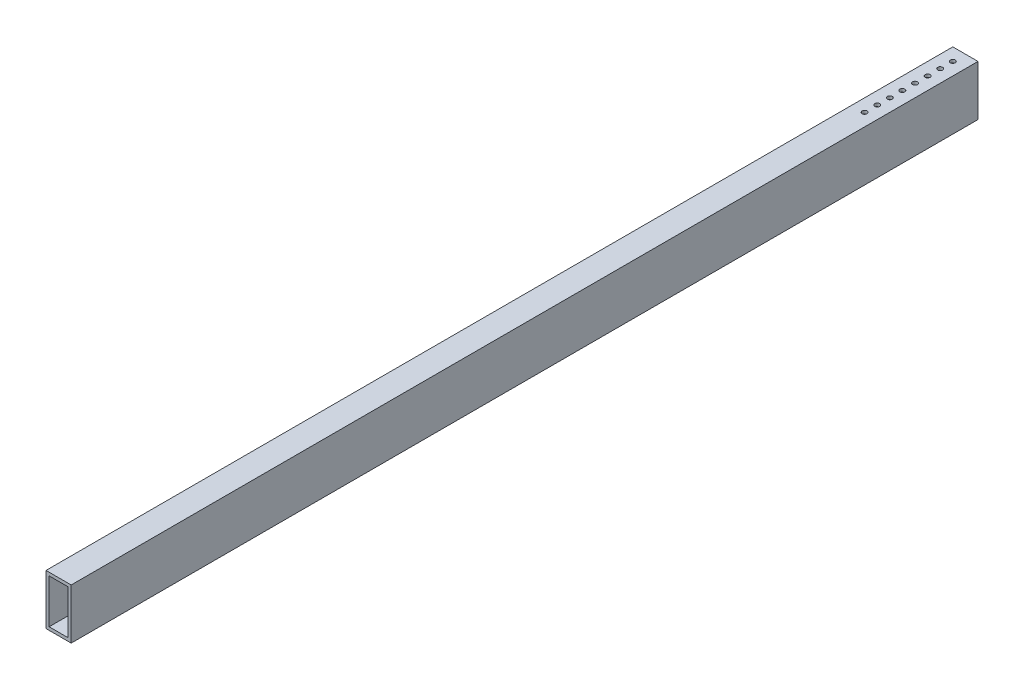
ISO-10303-21;
HEADER;
FILE_DESCRIPTION(('STEP AP214'),'2;1');
FILE_NAME('part.step','',(''),(''),'','','');
FILE_SCHEMA(('AUTOMOTIVE_DESIGN { 1 0 10303 214 1 1 1 1 }'));
ENDSEC;
DATA;
#1=APPLICATION_CONTEXT('core data for automotive mechanical design processes');
#2=APPLICATION_PROTOCOL_DEFINITION('international standard','automotive_design',2000,#1);
#3=PRODUCT_CONTEXT('',#1,'mechanical');
#4=PRODUCT('Part','Part','',(#3));
#5=PRODUCT_RELATED_PRODUCT_CATEGORY('part','',(#4));
#6=PRODUCT_DEFINITION_FORMATION('','',#4);
#7=PRODUCT_DEFINITION_CONTEXT('part definition',#1,'design');
#8=PRODUCT_DEFINITION('design','',#6,#7);
#9=PRODUCT_DEFINITION_SHAPE('','',#8);
#10=(LENGTH_UNIT() NAMED_UNIT(*) SI_UNIT(.MILLI.,.METRE.));
#11=(NAMED_UNIT(*) PLANE_ANGLE_UNIT() SI_UNIT($,.RADIAN.));
#12=(NAMED_UNIT(*) SI_UNIT($,.STERADIAN.) SOLID_ANGLE_UNIT());
#13=UNCERTAINTY_MEASURE_WITH_UNIT(LENGTH_MEASURE(1.E-05),#10,'distance_accuracy_value','');
#14=(GEOMETRIC_REPRESENTATION_CONTEXT(3) GLOBAL_UNCERTAINTY_ASSIGNED_CONTEXT((#13)) GLOBAL_UNIT_ASSIGNED_CONTEXT((#10,
#11,#12)) REPRESENTATION_CONTEXT('',''));
#15=CARTESIAN_POINT('',(0.,0.,0.));
#16=DIRECTION('',(0.,0.,1.));
#17=DIRECTION('',(1.,0.,0.));
#18=AXIS2_PLACEMENT_3D('',#15,#16,#17);
#19=CARTESIAN_POINT('',(0.,0.,914.4));
#20=DIRECTION('',(0.,0.,-1.));
#21=DIRECTION('',(-1.,0.,0.));
#22=AXIS2_PLACEMENT_3D('',#19,#20,#21);
#23=PLANE('',#22);
#24=DIRECTION('',(0.,1.,0.));
#25=VECTOR('',#24,1.);
#26=CARTESIAN_POINT('',(12.7,-25.4,914.4));
#27=LINE('',#26,#25);
#28=CARTESIAN_POINT('',(12.7,-25.4,914.4));
#29=VERTEX_POINT('',#28);
#30=CARTESIAN_POINT('',(12.7,25.4,914.4));
#31=VERTEX_POINT('',#30);
#32=EDGE_CURVE('E157',#29,#31,#27,.T.);
#33=ORIENTED_EDGE('',*,*,#32,.T.);
#34=DIRECTION('',(-1.,0.,0.));
#35=VECTOR('',#34,1.);
#36=CARTESIAN_POINT('',(-12.7,25.4,914.4));
#37=LINE('',#36,#35);
#38=CARTESIAN_POINT('',(-12.7,25.4,914.4));
#39=VERTEX_POINT('',#38);
#40=EDGE_CURVE('E161',#31,#39,#37,.T.);
#41=ORIENTED_EDGE('',*,*,#40,.T.);
#42=DIRECTION('',(0.,-1.,0.));
#43=VECTOR('',#42,1.);
#44=CARTESIAN_POINT('',(-12.7,-25.4,914.4));
#45=LINE('',#44,#43);
#46=CARTESIAN_POINT('',(-12.7,-25.4,914.4));
#47=VERTEX_POINT('',#46);
#48=EDGE_CURVE('E165',#39,#47,#45,.T.);
#49=ORIENTED_EDGE('',*,*,#48,.T.);
#50=DIRECTION('',(1.,0.,0.));
#51=VECTOR('',#50,1.);
#52=CARTESIAN_POINT('',(-12.7,-25.4,914.4));
#53=LINE('',#52,#51);
#54=EDGE_CURVE('E168',#47,#29,#53,.T.);
#55=ORIENTED_EDGE('',*,*,#54,.T.);
#56=EDGE_LOOP('',(#33,#41,#49,#55));
#57=FACE_BOUND('',#56,.T.);
#58=DIRECTION('',(1.,0.,0.));
#59=VECTOR('',#58,1.);
#60=CARTESIAN_POINT('',(-9.525,-22.225,914.4));
#61=LINE('',#60,#59);
#62=CARTESIAN_POINT('',(-9.525,-22.225,914.4));
#63=VERTEX_POINT('',#62);
#64=CARTESIAN_POINT('',(9.52499999999999,-22.225,914.4));
#65=VERTEX_POINT('',#64);
#66=EDGE_CURVE('E107',#63,#65,#61,.T.);
#67=ORIENTED_EDGE('',*,*,#66,.F.);
#68=DIRECTION('',(0.,-1.,0.));
#69=VECTOR('',#68,1.);
#70=CARTESIAN_POINT('',(-9.525,-22.225,914.4));
#71=LINE('',#70,#69);
#72=CARTESIAN_POINT('',(-9.525,22.225,914.4));
#73=VERTEX_POINT('',#72);
#74=EDGE_CURVE('E133',#73,#63,#71,.T.);
#75=ORIENTED_EDGE('',*,*,#74,.F.);
#76=DIRECTION('',(-1.,0.,0.));
#77=VECTOR('',#76,1.);
#78=CARTESIAN_POINT('',(-9.525,22.225,914.4));
#79=LINE('',#78,#77);
#80=CARTESIAN_POINT('',(9.525,22.225,914.4));
#81=VERTEX_POINT('',#80);
#82=EDGE_CURVE('E129',#81,#73,#79,.T.);
#83=ORIENTED_EDGE('',*,*,#82,.F.);
#84=DIRECTION('',(0.,1.,0.));
#85=VECTOR('',#84,1.);
#86=CARTESIAN_POINT('',(9.52499999999999,-22.225,914.4));
#87=LINE('',#86,#85);
#88=EDGE_CURVE('E116',#65,#81,#87,.T.);
#89=ORIENTED_EDGE('',*,*,#88,.F.);
#90=EDGE_LOOP('',(#67,#75,#83,#89));
#91=FACE_BOUND('',#90,.T.);
#92=ADVANCED_FACE('F39',(#57,#91),#23,.F.);
#93=CARTESIAN_POINT('',(0.,0.,0.));
#94=DIRECTION('',(0.,0.,-1.));
#95=DIRECTION('',(-1.,0.,0.));
#96=AXIS2_PLACEMENT_3D('',#93,#94,#95);
#97=PLANE('',#96);
#98=DIRECTION('',(0.,1.,0.));
#99=VECTOR('',#98,1.);
#100=CARTESIAN_POINT('',(12.7,-25.4,0.));
#101=LINE('',#100,#99);
#102=CARTESIAN_POINT('',(12.7,-25.4,0.));
#103=VERTEX_POINT('',#102);
#104=CARTESIAN_POINT('',(12.7,25.4,0.));
#105=VERTEX_POINT('',#104);
#106=EDGE_CURVE('E125',#103,#105,#101,.T.);
#107=ORIENTED_EDGE('',*,*,#106,.F.);
#108=DIRECTION('',(1.,0.,0.));
#109=VECTOR('',#108,1.);
#110=CARTESIAN_POINT('',(-12.7,-25.4,0.));
#111=LINE('',#110,#109);
#112=CARTESIAN_POINT('',(-12.7,-25.4,0.));
#113=VERTEX_POINT('',#112);
#114=EDGE_CURVE('E162',#113,#103,#111,.T.);
#115=ORIENTED_EDGE('',*,*,#114,.F.);
#116=DIRECTION('',(0.,-1.,0.));
#117=VECTOR('',#116,1.);
#118=CARTESIAN_POINT('',(-12.7,-25.4,0.));
#119=LINE('',#118,#117);
#120=CARTESIAN_POINT('',(-12.7,25.4,0.));
#121=VERTEX_POINT('',#120);
#122=EDGE_CURVE('E178',#121,#113,#119,.T.);
#123=ORIENTED_EDGE('',*,*,#122,.F.);
#124=DIRECTION('',(-1.,0.,0.));
#125=VECTOR('',#124,1.);
#126=CARTESIAN_POINT('',(-12.7,25.4,0.));
#127=LINE('',#126,#125);
#128=EDGE_CURVE('E175',#105,#121,#127,.T.);
#129=ORIENTED_EDGE('',*,*,#128,.F.);
#130=EDGE_LOOP('',(#107,#115,#123,#129));
#131=FACE_BOUND('',#130,.T.);
#132=DIRECTION('',(0.,-1.,0.));
#133=VECTOR('',#132,1.);
#134=CARTESIAN_POINT('',(-9.525,-22.225,0.));
#135=LINE('',#134,#133);
#136=CARTESIAN_POINT('',(-9.525,22.225,0.));
#137=VERTEX_POINT('',#136);
#138=CARTESIAN_POINT('',(-9.525,-22.225,0.));
#139=VERTEX_POINT('',#138);
#140=EDGE_CURVE('E117',#137,#139,#135,.T.);
#141=ORIENTED_EDGE('',*,*,#140,.T.);
#142=DIRECTION('',(1.,0.,0.));
#143=VECTOR('',#142,1.);
#144=CARTESIAN_POINT('',(-9.525,-22.225,0.));
#145=LINE('',#144,#143);
#146=CARTESIAN_POINT('',(9.52499999999999,-22.225,0.));
#147=VERTEX_POINT('',#146);
#148=EDGE_CURVE('E65',#139,#147,#145,.T.);
#149=ORIENTED_EDGE('',*,*,#148,.T.);
#150=DIRECTION('',(0.,1.,0.));
#151=VECTOR('',#150,1.);
#152=CARTESIAN_POINT('',(9.52499999999999,-22.225,0.));
#153=LINE('',#152,#151);
#154=CARTESIAN_POINT('',(9.525,22.225,0.));
#155=VERTEX_POINT('',#154);
#156=EDGE_CURVE('E123',#147,#155,#153,.T.);
#157=ORIENTED_EDGE('',*,*,#156,.T.);
#158=DIRECTION('',(-1.,0.,0.));
#159=VECTOR('',#158,1.);
#160=CARTESIAN_POINT('',(-9.525,22.225,0.));
#161=LINE('',#160,#159);
#162=EDGE_CURVE('E144',#155,#137,#161,.T.);
#163=ORIENTED_EDGE('',*,*,#162,.T.);
#164=EDGE_LOOP('',(#141,#149,#157,#163));
#165=FACE_BOUND('',#164,.T.);
#166=ADVANCED_FACE('F270',(#131,#165),#97,.T.);
#167=CARTESIAN_POINT('',(12.7,-25.4,914.4));
#168=DIRECTION('',(-1.,0.,0.));
#169=DIRECTION('',(0.,0.,1.));
#170=AXIS2_PLACEMENT_3D('',#167,#168,#169);
#171=PLANE('',#170);
#172=ORIENTED_EDGE('',*,*,#106,.T.);
#173=DIRECTION('',(0.,0.,-1.));
#174=VECTOR('',#173,1.);
#175=CARTESIAN_POINT('',(12.7,25.4,914.4));
#176=LINE('',#175,#174);
#177=EDGE_CURVE('E11',#31,#105,#176,.T.);
#178=ORIENTED_EDGE('',*,*,#177,.F.);
#179=ORIENTED_EDGE('',*,*,#32,.F.);
#180=DIRECTION('',(0.,0.,-1.));
#181=VECTOR('',#180,1.);
#182=CARTESIAN_POINT('',(12.7,-25.4,914.4));
#183=LINE('',#182,#181);
#184=EDGE_CURVE('E171',#29,#103,#183,.T.);
#185=ORIENTED_EDGE('',*,*,#184,.T.);
#186=EDGE_LOOP('',(#172,#178,#179,#185));
#187=FACE_BOUND('',#186,.T.);
#188=ADVANCED_FACE('F41',(#187),#171,.F.);
#189=CARTESIAN_POINT('',(-12.7,25.4,914.4));
#190=DIRECTION('',(0.,-1.,0.));
#191=DIRECTION('',(0.,0.,-1.));
#192=AXIS2_PLACEMENT_3D('',#189,#190,#191);
#193=PLANE('',#192);
#194=CARTESIAN_POINT('',(0.,25.4,12.7));
#195=DIRECTION('',(0.,1.,0.));
#196=DIRECTION('',(0.,0.,1.));
#197=AXIS2_PLACEMENT_3D('',#194,#195,#196);
#198=CIRCLE('',#197,2.4892);
#199=CARTESIAN_POINT('',(0.,25.4,15.1892));
#200=VERTEX_POINT('',#199);
#201=EDGE_CURVE('E309',#200,#200,#198,.T.);
#202=ORIENTED_EDGE('',*,*,#201,.F.);
#203=EDGE_LOOP('',(#202));
#204=FACE_BOUND('',#203,.T.);
#205=CARTESIAN_POINT('',(1.33803089727382E-13,25.4,25.4));
#206=DIRECTION('',(0.,1.,0.));
#207=DIRECTION('',(0.,0.,1.));
#208=AXIS2_PLACEMENT_3D('',#205,#206,#207);
#209=CIRCLE('',#208,2.4892);
#210=CARTESIAN_POINT('',(1.33803089727382E-13,25.4,27.8892));
#211=VERTEX_POINT('',#210);
#212=EDGE_CURVE('E313',#211,#211,#209,.T.);
#213=ORIENTED_EDGE('',*,*,#212,.F.);
#214=EDGE_LOOP('',(#213));
#215=FACE_BOUND('',#214,.T.);
#216=CARTESIAN_POINT('',(2.66050878019847E-13,25.4,38.1));
#217=DIRECTION('',(0.,1.,0.));
#218=DIRECTION('',(0.,0.,1.));
#219=AXIS2_PLACEMENT_3D('',#216,#217,#218);
#220=CIRCLE('',#219,2.4892);
#221=CARTESIAN_POINT('',(2.66050878019847E-13,25.4,40.5892));
#222=VERTEX_POINT('',#221);
#223=EDGE_CURVE('E317',#222,#222,#220,.T.);
#224=ORIENTED_EDGE('',*,*,#223,.F.);
#225=EDGE_LOOP('',(#224));
#226=FACE_BOUND('',#225,.T.);
#227=CARTESIAN_POINT('',(3.98298666312312E-13,25.4,50.8));
#228=DIRECTION('',(0.,1.,0.));
#229=DIRECTION('',(0.,0.,1.));
#230=AXIS2_PLACEMENT_3D('',#227,#228,#229);
#231=CIRCLE('',#230,2.4892);
#232=CARTESIAN_POINT('',(3.98298666312312E-13,25.4,53.2892));
#233=VERTEX_POINT('',#232);
#234=EDGE_CURVE('E321',#233,#233,#231,.T.);
#235=ORIENTED_EDGE('',*,*,#234,.F.);
#236=EDGE_LOOP('',(#235));
#237=FACE_BOUND('',#236,.T.);
#238=CARTESIAN_POINT('',(5.30546454604776E-13,25.4,63.5));
#239=DIRECTION('',(0.,1.,0.));
#240=DIRECTION('',(0.,0.,1.));
#241=AXIS2_PLACEMENT_3D('',#238,#239,#240);
#242=CIRCLE('',#241,2.4892);
#243=CARTESIAN_POINT('',(5.30546454604776E-13,25.4,65.9892));
#244=VERTEX_POINT('',#243);
#245=EDGE_CURVE('E325',#244,#244,#242,.T.);
#246=ORIENTED_EDGE('',*,*,#245,.F.);
#247=EDGE_LOOP('',(#246));
#248=FACE_BOUND('',#247,.T.);
#249=CARTESIAN_POINT('',(6.62794242897241E-13,25.4,76.2));
#250=DIRECTION('',(0.,1.,0.));
#251=DIRECTION('',(0.,0.,1.));
#252=AXIS2_PLACEMENT_3D('',#249,#250,#251);
#253=CIRCLE('',#252,2.4892);
#254=CARTESIAN_POINT('',(6.62794242897241E-13,25.4,78.6892));
#255=VERTEX_POINT('',#254);
#256=EDGE_CURVE('E329',#255,#255,#253,.T.);
#257=ORIENTED_EDGE('',*,*,#256,.F.);
#258=EDGE_LOOP('',(#257));
#259=FACE_BOUND('',#258,.T.);
#260=CARTESIAN_POINT('',(7.95042031189706E-13,25.4,88.9));
#261=DIRECTION('',(0.,1.,0.));
#262=DIRECTION('',(0.,0.,1.));
#263=AXIS2_PLACEMENT_3D('',#260,#261,#262);
#264=CIRCLE('',#263,2.4892);
#265=CARTESIAN_POINT('',(7.95042031189706E-13,25.4,91.3892));
#266=VERTEX_POINT('',#265);
#267=EDGE_CURVE('E333',#266,#266,#264,.T.);
#268=ORIENTED_EDGE('',*,*,#267,.F.);
#269=EDGE_LOOP('',(#268));
#270=FACE_BOUND('',#269,.T.);
#271=CARTESIAN_POINT('',(9.27289819482171E-13,25.4,101.6));
#272=DIRECTION('',(0.,1.,0.));
#273=DIRECTION('',(0.,0.,1.));
#274=AXIS2_PLACEMENT_3D('',#271,#272,#273);
#275=CIRCLE('',#274,2.4892);
#276=CARTESIAN_POINT('',(9.27289819482171E-13,25.4,104.0892));
#277=VERTEX_POINT('',#276);
#278=EDGE_CURVE('E337',#277,#277,#275,.T.);
#279=ORIENTED_EDGE('',*,*,#278,.F.);
#280=EDGE_LOOP('',(#279));
#281=FACE_BOUND('',#280,.T.);
#282=ORIENTED_EDGE('',*,*,#128,.T.);
#283=DIRECTION('',(0.,0.,-1.));
#284=VECTOR('',#283,1.);
#285=CARTESIAN_POINT('',(-12.7,25.4,914.4));
#286=LINE('',#285,#284);
#287=EDGE_CURVE('E49',#39,#121,#286,.T.);
#288=ORIENTED_EDGE('',*,*,#287,.F.);
#289=ORIENTED_EDGE('',*,*,#40,.F.);
#290=ORIENTED_EDGE('',*,*,#177,.T.);
#291=EDGE_LOOP('',(#282,#288,#289,#290));
#292=FACE_BOUND('',#291,.T.);
#293=ADVANCED_FACE('F298',(#204,#215,#226,#237,#248,#259,#270,#281,#292),#193,.F.);
#294=CARTESIAN_POINT('',(-12.7,-25.4,914.4));
#295=DIRECTION('',(1.,0.,0.));
#296=DIRECTION('',(0.,0.,-1.));
#297=AXIS2_PLACEMENT_3D('',#294,#295,#296);
#298=PLANE('',#297);
#299=ORIENTED_EDGE('',*,*,#122,.T.);
#300=DIRECTION('',(0.,0.,-1.));
#301=VECTOR('',#300,1.);
#302=CARTESIAN_POINT('',(-12.7,-25.4,914.4));
#303=LINE('',#302,#301);
#304=EDGE_CURVE('E186',#47,#113,#303,.T.);
#305=ORIENTED_EDGE('',*,*,#304,.F.);
#306=ORIENTED_EDGE('',*,*,#48,.F.);
#307=ORIENTED_EDGE('',*,*,#287,.T.);
#308=EDGE_LOOP('',(#299,#305,#306,#307));
#309=FACE_BOUND('',#308,.T.);
#310=ADVANCED_FACE('F295',(#309),#298,.F.);
#311=CARTESIAN_POINT('',(-12.7,-25.4,914.4));
#312=DIRECTION('',(0.,1.,0.));
#313=DIRECTION('',(0.,0.,1.));
#314=AXIS2_PLACEMENT_3D('',#311,#312,#313);
#315=PLANE('',#314);
#316=CARTESIAN_POINT('',(0.,-25.4,12.7));
#317=DIRECTION('',(0.,1.,0.));
#318=DIRECTION('',(0.,0.,1.));
#319=AXIS2_PLACEMENT_3D('',#316,#317,#318);
#320=CIRCLE('',#319,2.4892);
#321=CARTESIAN_POINT('',(0.,-25.4,15.1892));
#322=VERTEX_POINT('',#321);
#323=EDGE_CURVE('E198',#322,#322,#320,.T.);
#324=ORIENTED_EDGE('',*,*,#323,.T.);
#325=EDGE_LOOP('',(#324));
#326=FACE_BOUND('',#325,.T.);
#327=CARTESIAN_POINT('',(1.33803089727382E-13,-25.4,25.4));
#328=DIRECTION('',(0.,1.,0.));
#329=DIRECTION('',(0.,0.,1.));
#330=AXIS2_PLACEMENT_3D('',#327,#328,#329);
#331=CIRCLE('',#330,2.4892);
#332=CARTESIAN_POINT('',(1.33803089727382E-13,-25.4,27.8892));
#333=VERTEX_POINT('',#332);
#334=EDGE_CURVE('E433',#333,#333,#331,.T.);
#335=ORIENTED_EDGE('',*,*,#334,.T.);
#336=EDGE_LOOP('',(#335));
#337=FACE_BOUND('',#336,.T.);
#338=CARTESIAN_POINT('',(2.66050878019847E-13,-25.4,38.1));
#339=DIRECTION('',(0.,1.,0.));
#340=DIRECTION('',(0.,0.,1.));
#341=AXIS2_PLACEMENT_3D('',#338,#339,#340);
#342=CIRCLE('',#341,2.4892);
#343=CARTESIAN_POINT('',(2.66050878019847E-13,-25.4,40.5892));
#344=VERTEX_POINT('',#343);
#345=EDGE_CURVE('E440',#344,#344,#342,.T.);
#346=ORIENTED_EDGE('',*,*,#345,.T.);
#347=EDGE_LOOP('',(#346));
#348=FACE_BOUND('',#347,.T.);
#349=CARTESIAN_POINT('',(3.98298666312312E-13,-25.4,50.8));
#350=DIRECTION('',(0.,1.,0.));
#351=DIRECTION('',(0.,0.,1.));
#352=AXIS2_PLACEMENT_3D('',#349,#350,#351);
#353=CIRCLE('',#352,2.4892);
#354=CARTESIAN_POINT('',(3.98298666312312E-13,-25.4,53.2892));
#355=VERTEX_POINT('',#354);
#356=EDGE_CURVE('E449',#355,#355,#353,.T.);
#357=ORIENTED_EDGE('',*,*,#356,.T.);
#358=EDGE_LOOP('',(#357));
#359=FACE_BOUND('',#358,.T.);
#360=CARTESIAN_POINT('',(5.30546454604776E-13,-25.4,63.5));
#361=DIRECTION('',(0.,1.,0.));
#362=DIRECTION('',(0.,0.,1.));
#363=AXIS2_PLACEMENT_3D('',#360,#361,#362);
#364=CIRCLE('',#363,2.4892);
#365=CARTESIAN_POINT('',(5.30546454604776E-13,-25.4,65.9892));
#366=VERTEX_POINT('',#365);
#367=EDGE_CURVE('E455',#366,#366,#364,.T.);
#368=ORIENTED_EDGE('',*,*,#367,.T.);
#369=EDGE_LOOP('',(#368));
#370=FACE_BOUND('',#369,.T.);
#371=CARTESIAN_POINT('',(6.62794242897241E-13,-25.4,76.2));
#372=DIRECTION('',(0.,1.,0.));
#373=DIRECTION('',(0.,0.,1.));
#374=AXIS2_PLACEMENT_3D('',#371,#372,#373);
#375=CIRCLE('',#374,2.4892);
#376=CARTESIAN_POINT('',(6.62794242897241E-13,-25.4,78.6892));
#377=VERTEX_POINT('',#376);
#378=EDGE_CURVE('E461',#377,#377,#375,.T.);
#379=ORIENTED_EDGE('',*,*,#378,.T.);
#380=EDGE_LOOP('',(#379));
#381=FACE_BOUND('',#380,.T.);
#382=CARTESIAN_POINT('',(7.95042031189706E-13,-25.4,88.9));
#383=DIRECTION('',(0.,1.,0.));
#384=DIRECTION('',(0.,0.,1.));
#385=AXIS2_PLACEMENT_3D('',#382,#383,#384);
#386=CIRCLE('',#385,2.4892);
#387=CARTESIAN_POINT('',(7.95042031189706E-13,-25.4,91.3892));
#388=VERTEX_POINT('',#387);
#389=EDGE_CURVE('E467',#388,#388,#386,.T.);
#390=ORIENTED_EDGE('',*,*,#389,.T.);
#391=EDGE_LOOP('',(#390));
#392=FACE_BOUND('',#391,.T.);
#393=CARTESIAN_POINT('',(9.27289819482171E-13,-25.4,101.6));
#394=DIRECTION('',(0.,1.,0.));
#395=DIRECTION('',(0.,0.,1.));
#396=AXIS2_PLACEMENT_3D('',#393,#394,#395);
#397=CIRCLE('',#396,2.4892);
#398=CARTESIAN_POINT('',(9.27289819482171E-13,-25.4,104.0892));
#399=VERTEX_POINT('',#398);
#400=EDGE_CURVE('E351',#399,#399,#397,.T.);
#401=ORIENTED_EDGE('',*,*,#400,.T.);
#402=EDGE_LOOP('',(#401));
#403=FACE_BOUND('',#402,.T.);
#404=ORIENTED_EDGE('',*,*,#114,.T.);
#405=ORIENTED_EDGE('',*,*,#184,.F.);
#406=ORIENTED_EDGE('',*,*,#54,.F.);
#407=ORIENTED_EDGE('',*,*,#304,.T.);
#408=EDGE_LOOP('',(#404,#405,#406,#407));
#409=FACE_BOUND('',#408,.T.);
#410=ADVANCED_FACE('F292',(#326,#337,#348,#359,#370,#381,#392,#403,#409),#315,.F.);
#411=CARTESIAN_POINT('',(-9.525,-22.225,914.4));
#412=DIRECTION('',(0.,1.,0.));
#413=DIRECTION('',(0.,0.,1.));
#414=AXIS2_PLACEMENT_3D('',#411,#412,#413);
#415=PLANE('',#414);
#416=CARTESIAN_POINT('',(0.,-22.225,12.7));
#417=DIRECTION('',(0.,1.,0.));
#418=DIRECTION('',(0.,0.,1.));
#419=AXIS2_PLACEMENT_3D('',#416,#417,#418);
#420=CIRCLE('',#419,2.4892);
#421=CARTESIAN_POINT('',(0.,-22.225,15.1892));
#422=VERTEX_POINT('',#421);
#423=EDGE_CURVE('E141',#422,#422,#420,.T.);
#424=ORIENTED_EDGE('',*,*,#423,.F.);
#425=EDGE_LOOP('',(#424));
#426=FACE_BOUND('',#425,.T.);
#427=CARTESIAN_POINT('',(1.33803089727382E-13,-22.225,25.4));
#428=DIRECTION('',(0.,1.,0.));
#429=DIRECTION('',(0.,0.,1.));
#430=AXIS2_PLACEMENT_3D('',#427,#428,#429);
#431=CIRCLE('',#430,2.4892);
#432=CARTESIAN_POINT('',(1.33803089727382E-13,-22.225,27.8892));
#433=VERTEX_POINT('',#432);
#434=EDGE_CURVE('E226',#433,#433,#431,.T.);
#435=ORIENTED_EDGE('',*,*,#434,.F.);
#436=EDGE_LOOP('',(#435));
#437=FACE_BOUND('',#436,.T.);
#438=CARTESIAN_POINT('',(2.66050878019847E-13,-22.225,38.1));
#439=DIRECTION('',(0.,1.,0.));
#440=DIRECTION('',(0.,0.,1.));
#441=AXIS2_PLACEMENT_3D('',#438,#439,#440);
#442=CIRCLE('',#441,2.4892);
#443=CARTESIAN_POINT('',(2.66050878019847E-13,-22.225,40.5892));
#444=VERTEX_POINT('',#443);
#445=EDGE_CURVE('E222',#444,#444,#442,.T.);
#446=ORIENTED_EDGE('',*,*,#445,.F.);
#447=EDGE_LOOP('',(#446));
#448=FACE_BOUND('',#447,.T.);
#449=CARTESIAN_POINT('',(3.98298666312312E-13,-22.225,50.8));
#450=DIRECTION('',(0.,1.,0.));
#451=DIRECTION('',(0.,0.,1.));
#452=AXIS2_PLACEMENT_3D('',#449,#450,#451);
#453=CIRCLE('',#452,2.4892);
#454=CARTESIAN_POINT('',(3.98298666312312E-13,-22.225,53.2892));
#455=VERTEX_POINT('',#454);
#456=EDGE_CURVE('E218',#455,#455,#453,.T.);
#457=ORIENTED_EDGE('',*,*,#456,.F.);
#458=EDGE_LOOP('',(#457));
#459=FACE_BOUND('',#458,.T.);
#460=CARTESIAN_POINT('',(5.30546454604776E-13,-22.225,63.5));
#461=DIRECTION('',(0.,1.,0.));
#462=DIRECTION('',(0.,0.,1.));
#463=AXIS2_PLACEMENT_3D('',#460,#461,#462);
#464=CIRCLE('',#463,2.4892);
#465=CARTESIAN_POINT('',(5.30546454604776E-13,-22.225,65.9892));
#466=VERTEX_POINT('',#465);
#467=EDGE_CURVE('E213',#466,#466,#464,.T.);
#468=ORIENTED_EDGE('',*,*,#467,.F.);
#469=EDGE_LOOP('',(#468));
#470=FACE_BOUND('',#469,.T.);
#471=CARTESIAN_POINT('',(6.62794242897241E-13,-22.225,76.2));
#472=DIRECTION('',(0.,1.,0.));
#473=DIRECTION('',(0.,0.,1.));
#474=AXIS2_PLACEMENT_3D('',#471,#472,#473);
#475=CIRCLE('',#474,2.4892);
#476=CARTESIAN_POINT('',(6.62794242897241E-13,-22.225,78.6892));
#477=VERTEX_POINT('',#476);
#478=EDGE_CURVE('E208',#477,#477,#475,.T.);
#479=ORIENTED_EDGE('',*,*,#478,.F.);
#480=EDGE_LOOP('',(#479));
#481=FACE_BOUND('',#480,.T.);
#482=CARTESIAN_POINT('',(7.95042031189706E-13,-22.225,88.9));
#483=DIRECTION('',(0.,1.,0.));
#484=DIRECTION('',(0.,0.,1.));
#485=AXIS2_PLACEMENT_3D('',#482,#483,#484);
#486=CIRCLE('',#485,2.4892);
#487=CARTESIAN_POINT('',(7.95042031189706E-13,-22.225,91.3892));
#488=VERTEX_POINT('',#487);
#489=EDGE_CURVE('E203',#488,#488,#486,.T.);
#490=ORIENTED_EDGE('',*,*,#489,.F.);
#491=EDGE_LOOP('',(#490));
#492=FACE_BOUND('',#491,.T.);
#493=CARTESIAN_POINT('',(9.27289819482171E-13,-22.225,101.6));
#494=DIRECTION('',(0.,1.,0.));
#495=DIRECTION('',(0.,0.,1.));
#496=AXIS2_PLACEMENT_3D('',#493,#494,#495);
#497=CIRCLE('',#496,2.4892);
#498=CARTESIAN_POINT('',(9.27289819482171E-13,-22.225,104.0892));
#499=VERTEX_POINT('',#498);
#500=EDGE_CURVE('E197',#499,#499,#497,.T.);
#501=ORIENTED_EDGE('',*,*,#500,.F.);
#502=EDGE_LOOP('',(#501));
#503=FACE_BOUND('',#502,.T.);
#504=ORIENTED_EDGE('',*,*,#148,.F.);
#505=DIRECTION('',(0.,0.,-1.));
#506=VECTOR('',#505,1.);
#507=CARTESIAN_POINT('',(-9.525,-22.225,914.4));
#508=LINE('',#507,#506);
#509=EDGE_CURVE('E111',#63,#139,#508,.T.);
#510=ORIENTED_EDGE('',*,*,#509,.F.);
#511=ORIENTED_EDGE('',*,*,#66,.T.);
#512=DIRECTION('',(0.,0.,-1.));
#513=VECTOR('',#512,1.);
#514=CARTESIAN_POINT('',(9.52499999999999,-22.225,914.4));
#515=LINE('',#514,#513);
#516=EDGE_CURVE('E110',#65,#147,#515,.T.);
#517=ORIENTED_EDGE('',*,*,#516,.T.);
#518=EDGE_LOOP('',(#504,#510,#511,#517));
#519=FACE_BOUND('',#518,.T.);
#520=ADVANCED_FACE('F109',(#426,#437,#448,#459,#470,#481,#492,#503,#519),#415,.T.);
#521=CARTESIAN_POINT('',(9.52499999999999,-22.225,914.4));
#522=DIRECTION('',(-1.,0.,0.));
#523=DIRECTION('',(0.,-1.,0.));
#524=AXIS2_PLACEMENT_3D('',#521,#522,#523);
#525=PLANE('',#524);
#526=ORIENTED_EDGE('',*,*,#156,.F.);
#527=ORIENTED_EDGE('',*,*,#516,.F.);
#528=ORIENTED_EDGE('',*,*,#88,.T.);
#529=DIRECTION('',(0.,0.,-1.));
#530=VECTOR('',#529,1.);
#531=CARTESIAN_POINT('',(9.525,22.225,914.4));
#532=LINE('',#531,#530);
#533=EDGE_CURVE('E126',#81,#155,#532,.T.);
#534=ORIENTED_EDGE('',*,*,#533,.T.);
#535=EDGE_LOOP('',(#526,#527,#528,#534));
#536=FACE_BOUND('',#535,.T.);
#537=ADVANCED_FACE('F120',(#536),#525,.T.);
#538=CARTESIAN_POINT('',(-9.525,22.225,914.4));
#539=DIRECTION('',(0.,-1.,0.));
#540=DIRECTION('',(1.,0.,0.));
#541=AXIS2_PLACEMENT_3D('',#538,#539,#540);
#542=PLANE('',#541);
#543=CARTESIAN_POINT('',(0.,22.225,12.7));
#544=DIRECTION('',(0.,-1.,0.));
#545=DIRECTION('',(1.,0.,0.));
#546=AXIS2_PLACEMENT_3D('',#543,#544,#545);
#547=CIRCLE('',#546,2.4892);
#548=CARTESIAN_POINT('',(2.4892,22.225,12.7));
#549=VERTEX_POINT('',#548);
#550=EDGE_CURVE('E43',#549,#549,#547,.T.);
#551=ORIENTED_EDGE('',*,*,#550,.F.);
#552=EDGE_LOOP('',(#551));
#553=FACE_BOUND('',#552,.T.);
#554=CARTESIAN_POINT('',(1.33803089727382E-13,22.225,25.4));
#555=DIRECTION('',(0.,-1.,0.));
#556=DIRECTION('',(1.,0.,0.));
#557=AXIS2_PLACEMENT_3D('',#554,#555,#556);
#558=CIRCLE('',#557,2.4892);
#559=CARTESIAN_POINT('',(2.48920000000013,22.225,25.4));
#560=VERTEX_POINT('',#559);
#561=EDGE_CURVE('E223',#560,#560,#558,.T.);
#562=ORIENTED_EDGE('',*,*,#561,.F.);
#563=EDGE_LOOP('',(#562));
#564=FACE_BOUND('',#563,.T.);
#565=CARTESIAN_POINT('',(2.66050878019847E-13,22.225,38.1));
#566=DIRECTION('',(0.,-1.,0.));
#567=DIRECTION('',(1.,0.,0.));
#568=AXIS2_PLACEMENT_3D('',#565,#566,#567);
#569=CIRCLE('',#568,2.4892);
#570=CARTESIAN_POINT('',(2.48920000000027,22.225,38.1));
#571=VERTEX_POINT('',#570);
#572=EDGE_CURVE('E219',#571,#571,#569,.T.);
#573=ORIENTED_EDGE('',*,*,#572,.F.);
#574=EDGE_LOOP('',(#573));
#575=FACE_BOUND('',#574,.T.);
#576=CARTESIAN_POINT('',(3.98298666312312E-13,22.225,50.8));
#577=DIRECTION('',(0.,-1.,0.));
#578=DIRECTION('',(1.,0.,0.));
#579=AXIS2_PLACEMENT_3D('',#576,#577,#578);
#580=CIRCLE('',#579,2.4892);
#581=CARTESIAN_POINT('',(2.4892000000004,22.225,50.8));
#582=VERTEX_POINT('',#581);
#583=EDGE_CURVE('E214',#582,#582,#580,.T.);
#584=ORIENTED_EDGE('',*,*,#583,.F.);
#585=EDGE_LOOP('',(#584));
#586=FACE_BOUND('',#585,.T.);
#587=CARTESIAN_POINT('',(5.30546454604776E-13,22.225,63.5));
#588=DIRECTION('',(0.,-1.,0.));
#589=DIRECTION('',(1.,0.,0.));
#590=AXIS2_PLACEMENT_3D('',#587,#588,#589);
#591=CIRCLE('',#590,2.4892);
#592=CARTESIAN_POINT('',(2.48920000000053,22.225,63.5));
#593=VERTEX_POINT('',#592);
#594=EDGE_CURVE('E209',#593,#593,#591,.T.);
#595=ORIENTED_EDGE('',*,*,#594,.F.);
#596=EDGE_LOOP('',(#595));
#597=FACE_BOUND('',#596,.T.);
#598=CARTESIAN_POINT('',(6.62794242897241E-13,22.225,76.2));
#599=DIRECTION('',(0.,-1.,0.));
#600=DIRECTION('',(1.,0.,0.));
#601=AXIS2_PLACEMENT_3D('',#598,#599,#600);
#602=CIRCLE('',#601,2.4892);
#603=CARTESIAN_POINT('',(2.48920000000066,22.225,76.2));
#604=VERTEX_POINT('',#603);
#605=EDGE_CURVE('E204',#604,#604,#602,.T.);
#606=ORIENTED_EDGE('',*,*,#605,.F.);
#607=EDGE_LOOP('',(#606));
#608=FACE_BOUND('',#607,.T.);
#609=CARTESIAN_POINT('',(7.95042031189706E-13,22.225,88.9));
#610=DIRECTION('',(0.,-1.,0.));
#611=DIRECTION('',(1.,0.,0.));
#612=AXIS2_PLACEMENT_3D('',#609,#610,#611);
#613=CIRCLE('',#612,2.4892);
#614=CARTESIAN_POINT('',(2.48920000000079,22.225,88.9));
#615=VERTEX_POINT('',#614);
#616=EDGE_CURVE('E199',#615,#615,#613,.T.);
#617=ORIENTED_EDGE('',*,*,#616,.F.);
#618=EDGE_LOOP('',(#617));
#619=FACE_BOUND('',#618,.T.);
#620=CARTESIAN_POINT('',(9.27289819482171E-13,22.225,101.6));
#621=DIRECTION('',(0.,-1.,0.));
#622=DIRECTION('',(1.,0.,0.));
#623=AXIS2_PLACEMENT_3D('',#620,#621,#622);
#624=CIRCLE('',#623,2.4892);
#625=CARTESIAN_POINT('',(2.48920000000093,22.225,101.6));
#626=VERTEX_POINT('',#625);
#627=EDGE_CURVE('E193',#626,#626,#624,.T.);
#628=ORIENTED_EDGE('',*,*,#627,.F.);
#629=EDGE_LOOP('',(#628));
#630=FACE_BOUND('',#629,.T.);
#631=ORIENTED_EDGE('',*,*,#162,.F.);
#632=ORIENTED_EDGE('',*,*,#533,.F.);
#633=ORIENTED_EDGE('',*,*,#82,.T.);
#634=DIRECTION('',(0.,0.,-1.));
#635=VECTOR('',#634,1.);
#636=CARTESIAN_POINT('',(-9.525,22.225,914.4));
#637=LINE('',#636,#635);
#638=EDGE_CURVE('E57',#73,#137,#637,.T.);
#639=ORIENTED_EDGE('',*,*,#638,.T.);
#640=EDGE_LOOP('',(#631,#632,#633,#639));
#641=FACE_BOUND('',#640,.T.);
#642=ADVANCED_FACE('F250',(#553,#564,#575,#586,#597,#608,#619,#630,#641),#542,.T.);
#643=CARTESIAN_POINT('',(-9.525,-22.225,914.4));
#644=DIRECTION('',(1.,0.,0.));
#645=DIRECTION('',(0.,0.,-1.));
#646=AXIS2_PLACEMENT_3D('',#643,#644,#645);
#647=PLANE('',#646);
#648=ORIENTED_EDGE('',*,*,#140,.F.);
#649=ORIENTED_EDGE('',*,*,#638,.F.);
#650=ORIENTED_EDGE('',*,*,#74,.T.);
#651=ORIENTED_EDGE('',*,*,#509,.T.);
#652=EDGE_LOOP('',(#648,#649,#650,#651));
#653=FACE_BOUND('',#652,.T.);
#654=ADVANCED_FACE('F253',(#653),#647,.T.);
#655=CARTESIAN_POINT('',(9.27289819482171E-13,-25.4,101.6));
#656=DIRECTION('',(0.,1.,0.));
#657=DIRECTION('',(0.,0.,1.));
#658=AXIS2_PLACEMENT_3D('',#655,#656,#657);
#659=CYLINDRICAL_SURFACE('',#658,2.4892);
#660=ORIENTED_EDGE('',*,*,#627,.T.);
#661=EDGE_LOOP('',(#660));
#662=FACE_BOUND('',#661,.T.);
#663=ORIENTED_EDGE('',*,*,#278,.T.);
#664=EDGE_LOOP('',(#663));
#665=FACE_BOUND('',#664,.T.);
#666=ADVANCED_FACE('F272',(#662,#665),#659,.F.);
#667=CARTESIAN_POINT('',(7.95042031189706E-13,-25.4,88.9));
#668=DIRECTION('',(0.,1.,0.));
#669=DIRECTION('',(0.,0.,1.));
#670=AXIS2_PLACEMENT_3D('',#667,#668,#669);
#671=CYLINDRICAL_SURFACE('',#670,2.4892);
#672=ORIENTED_EDGE('',*,*,#616,.T.);
#673=EDGE_LOOP('',(#672));
#674=FACE_BOUND('',#673,.T.);
#675=ORIENTED_EDGE('',*,*,#267,.T.);
#676=EDGE_LOOP('',(#675));
#677=FACE_BOUND('',#676,.T.);
#678=ADVANCED_FACE('F277',(#674,#677),#671,.F.);
#679=CARTESIAN_POINT('',(6.62794242897241E-13,-25.4,76.2));
#680=DIRECTION('',(0.,1.,0.));
#681=DIRECTION('',(0.,0.,1.));
#682=AXIS2_PLACEMENT_3D('',#679,#680,#681);
#683=CYLINDRICAL_SURFACE('',#682,2.4892);
#684=ORIENTED_EDGE('',*,*,#605,.T.);
#685=EDGE_LOOP('',(#684));
#686=FACE_BOUND('',#685,.T.);
#687=ORIENTED_EDGE('',*,*,#256,.T.);
#688=EDGE_LOOP('',(#687));
#689=FACE_BOUND('',#688,.T.);
#690=ADVANCED_FACE('F399',(#686,#689),#683,.F.);
#691=CARTESIAN_POINT('',(5.30546454604776E-13,-25.4,63.5));
#692=DIRECTION('',(0.,1.,0.));
#693=DIRECTION('',(0.,0.,1.));
#694=AXIS2_PLACEMENT_3D('',#691,#692,#693);
#695=CYLINDRICAL_SURFACE('',#694,2.4892);
#696=ORIENTED_EDGE('',*,*,#594,.T.);
#697=EDGE_LOOP('',(#696));
#698=FACE_BOUND('',#697,.T.);
#699=ORIENTED_EDGE('',*,*,#245,.T.);
#700=EDGE_LOOP('',(#699));
#701=FACE_BOUND('',#700,.T.);
#702=ADVANCED_FACE('F403',(#698,#701),#695,.F.);
#703=CARTESIAN_POINT('',(3.98298666312312E-13,-25.4,50.8));
#704=DIRECTION('',(0.,1.,0.));
#705=DIRECTION('',(0.,0.,1.));
#706=AXIS2_PLACEMENT_3D('',#703,#704,#705);
#707=CYLINDRICAL_SURFACE('',#706,2.4892);
#708=ORIENTED_EDGE('',*,*,#583,.T.);
#709=EDGE_LOOP('',(#708));
#710=FACE_BOUND('',#709,.T.);
#711=ORIENTED_EDGE('',*,*,#234,.T.);
#712=EDGE_LOOP('',(#711));
#713=FACE_BOUND('',#712,.T.);
#714=ADVANCED_FACE('F407',(#710,#713),#707,.F.);
#715=CARTESIAN_POINT('',(2.66050878019847E-13,-25.4,38.1));
#716=DIRECTION('',(0.,1.,0.));
#717=DIRECTION('',(0.,0.,1.));
#718=AXIS2_PLACEMENT_3D('',#715,#716,#717);
#719=CYLINDRICAL_SURFACE('',#718,2.4892);
#720=ORIENTED_EDGE('',*,*,#572,.T.);
#721=EDGE_LOOP('',(#720));
#722=FACE_BOUND('',#721,.T.);
#723=ORIENTED_EDGE('',*,*,#223,.T.);
#724=EDGE_LOOP('',(#723));
#725=FACE_BOUND('',#724,.T.);
#726=ADVANCED_FACE('F411',(#722,#725),#719,.F.);
#727=CARTESIAN_POINT('',(1.33803089727382E-13,-25.4,25.4));
#728=DIRECTION('',(0.,1.,0.));
#729=DIRECTION('',(0.,0.,1.));
#730=AXIS2_PLACEMENT_3D('',#727,#728,#729);
#731=CYLINDRICAL_SURFACE('',#730,2.4892);
#732=ORIENTED_EDGE('',*,*,#561,.T.);
#733=EDGE_LOOP('',(#732));
#734=FACE_BOUND('',#733,.T.);
#735=ORIENTED_EDGE('',*,*,#212,.T.);
#736=EDGE_LOOP('',(#735));
#737=FACE_BOUND('',#736,.T.);
#738=ADVANCED_FACE('F394',(#734,#737),#731,.F.);
#739=CARTESIAN_POINT('',(0.,-25.4,12.7));
#740=DIRECTION('',(0.,1.,0.));
#741=DIRECTION('',(0.,0.,1.));
#742=AXIS2_PLACEMENT_3D('',#739,#740,#741);
#743=CYLINDRICAL_SURFACE('',#742,2.4892);
#744=ORIENTED_EDGE('',*,*,#550,.T.);
#745=EDGE_LOOP('',(#744));
#746=FACE_BOUND('',#745,.T.);
#747=ORIENTED_EDGE('',*,*,#201,.T.);
#748=EDGE_LOOP('',(#747));
#749=FACE_BOUND('',#748,.T.);
#750=ADVANCED_FACE('F247',(#746,#749),#743,.F.);
#751=ORIENTED_EDGE('',*,*,#500,.T.);
#752=EDGE_LOOP('',(#751));
#753=FACE_BOUND('',#752,.T.);
#754=ORIENTED_EDGE('',*,*,#400,.F.);
#755=EDGE_LOOP('',(#754));
#756=FACE_BOUND('',#755,.T.);
#757=ADVANCED_FACE('F280',(#753,#756),#659,.F.);
#758=ORIENTED_EDGE('',*,*,#489,.T.);
#759=EDGE_LOOP('',(#758));
#760=FACE_BOUND('',#759,.T.);
#761=ORIENTED_EDGE('',*,*,#389,.F.);
#762=EDGE_LOOP('',(#761));
#763=FACE_BOUND('',#762,.T.);
#764=ADVANCED_FACE('F384',(#760,#763),#671,.F.);
#765=ORIENTED_EDGE('',*,*,#478,.T.);
#766=EDGE_LOOP('',(#765));
#767=FACE_BOUND('',#766,.T.);
#768=ORIENTED_EDGE('',*,*,#378,.F.);
#769=EDGE_LOOP('',(#768));
#770=FACE_BOUND('',#769,.T.);
#771=ADVANCED_FACE('F391',(#767,#770),#683,.F.);
#772=ORIENTED_EDGE('',*,*,#467,.T.);
#773=EDGE_LOOP('',(#772));
#774=FACE_BOUND('',#773,.T.);
#775=ORIENTED_EDGE('',*,*,#367,.F.);
#776=EDGE_LOOP('',(#775));
#777=FACE_BOUND('',#776,.T.);
#778=ADVANCED_FACE('F370',(#774,#777),#695,.F.);
#779=ORIENTED_EDGE('',*,*,#456,.T.);
#780=EDGE_LOOP('',(#779));
#781=FACE_BOUND('',#780,.T.);
#782=ORIENTED_EDGE('',*,*,#356,.F.);
#783=EDGE_LOOP('',(#782));
#784=FACE_BOUND('',#783,.T.);
#785=ADVANCED_FACE('F413',(#781,#784),#707,.F.);
#786=ORIENTED_EDGE('',*,*,#445,.T.);
#787=EDGE_LOOP('',(#786));
#788=FACE_BOUND('',#787,.T.);
#789=ORIENTED_EDGE('',*,*,#345,.F.);
#790=EDGE_LOOP('',(#789));
#791=FACE_BOUND('',#790,.T.);
#792=ADVANCED_FACE('F417',(#788,#791),#719,.F.);
#793=ORIENTED_EDGE('',*,*,#434,.T.);
#794=EDGE_LOOP('',(#793));
#795=FACE_BOUND('',#794,.T.);
#796=ORIENTED_EDGE('',*,*,#334,.F.);
#797=EDGE_LOOP('',(#796));
#798=FACE_BOUND('',#797,.T.);
#799=ADVANCED_FACE('F419',(#795,#798),#731,.F.);
#800=ORIENTED_EDGE('',*,*,#423,.T.);
#801=EDGE_LOOP('',(#800));
#802=FACE_BOUND('',#801,.T.);
#803=ORIENTED_EDGE('',*,*,#323,.F.);
#804=EDGE_LOOP('',(#803));
#805=FACE_BOUND('',#804,.T.);
#806=ADVANCED_FACE('F396',(#802,#805),#743,.F.);
#807=CLOSED_SHELL('',(#92,#166,#188,#293,#310,#410,#520,#537,#642,#654,#666,#678,#690,#702,#714,
#726,#738,#750,#757,#764,#771,#778,#785,#792,#799,#806));
#808=MANIFOLD_SOLID_BREP('B2',#807);
#809=ADVANCED_BREP_SHAPE_REPRESENTATION('',(#18,#808),#14);
#810=SHAPE_DEFINITION_REPRESENTATION(#9,#809);
ENDSEC;
END-ISO-10303-21;
